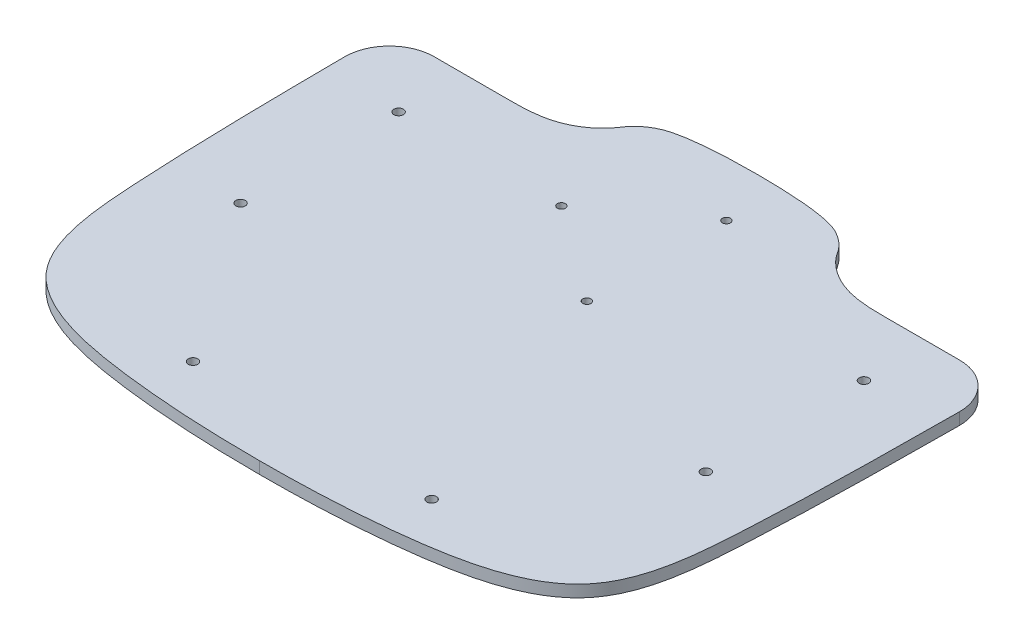
ISO-10303-21;
HEADER;
FILE_DESCRIPTION(('STEP AP214'),'2;1');
FILE_NAME('part.step','',(''),(''),'','','');
FILE_SCHEMA(('AUTOMOTIVE_DESIGN { 1 0 10303 214 1 1 1 1 }'));
ENDSEC;
DATA;
#1=APPLICATION_CONTEXT('core data for automotive mechanical design processes');
#2=APPLICATION_PROTOCOL_DEFINITION('international standard','automotive_design',2000,#1);
#3=PRODUCT_CONTEXT('',#1,'mechanical');
#4=PRODUCT('Part','Part','',(#3));
#5=PRODUCT_RELATED_PRODUCT_CATEGORY('part','',(#4));
#6=PRODUCT_DEFINITION_FORMATION('','',#4);
#7=PRODUCT_DEFINITION_CONTEXT('part definition',#1,'design');
#8=PRODUCT_DEFINITION('design','',#6,#7);
#9=PRODUCT_DEFINITION_SHAPE('','',#8);
#10=(LENGTH_UNIT() NAMED_UNIT(*) SI_UNIT(.MILLI.,.METRE.));
#11=(NAMED_UNIT(*) PLANE_ANGLE_UNIT() SI_UNIT($,.RADIAN.));
#12=(NAMED_UNIT(*) SI_UNIT($,.STERADIAN.) SOLID_ANGLE_UNIT());
#13=UNCERTAINTY_MEASURE_WITH_UNIT(LENGTH_MEASURE(1.E-05),#10,'distance_accuracy_value','');
#14=(GEOMETRIC_REPRESENTATION_CONTEXT(3) GLOBAL_UNCERTAINTY_ASSIGNED_CONTEXT((#13)) GLOBAL_UNIT_ASSIGNED_CONTEXT((#10,
#11,#12)) REPRESENTATION_CONTEXT('',''));
#15=CARTESIAN_POINT('',(0.,0.,0.));
#16=DIRECTION('',(0.,0.,1.));
#17=DIRECTION('',(1.,0.,0.));
#18=AXIS2_PLACEMENT_3D('',#15,#16,#17);
#19=CARTESIAN_POINT('',(0.,0.,0.));
#20=DIRECTION('',(0.,0.,1.));
#21=DIRECTION('',(1.,0.,0.));
#22=AXIS2_PLACEMENT_3D('',#19,#20,#21);
#23=PLANE('',#22);
#24=DIRECTION('',(1.,0.,0.));
#25=VECTOR('',#24,1.);
#26=CARTESIAN_POINT('',(0.,0.,0.));
#27=LINE('',#26,#25);
#28=CARTESIAN_POINT('',(-88.0691067868736,0.,0.));
#29=VERTEX_POINT('',#28);
#30=CARTESIAN_POINT('',(-62.5,0.,0.));
#31=VERTEX_POINT('',#30);
#32=EDGE_CURVE('E310',#29,#31,#27,.T.);
#33=ORIENTED_EDGE('',*,*,#32,.F.);
#34=DIRECTION('',(0.,1.,0.));
#35=VECTOR('',#34,1.);
#36=CARTESIAN_POINT('',(-88.0691067868736,0.,0.));
#37=LINE('',#36,#35);
#38=CARTESIAN_POINT('',(-88.0691067868736,4.,0.));
#39=VERTEX_POINT('',#38);
#40=EDGE_CURVE('E106',#29,#39,#37,.T.);
#41=ORIENTED_EDGE('',*,*,#40,.T.);
#42=DIRECTION('',(1.,0.,0.));
#43=VECTOR('',#42,1.);
#44=CARTESIAN_POINT('',(0.,4.,0.));
#45=LINE('',#44,#43);
#46=CARTESIAN_POINT('',(-62.5,4.,0.));
#47=VERTEX_POINT('',#46);
#48=EDGE_CURVE('E315',#39,#47,#45,.T.);
#49=ORIENTED_EDGE('',*,*,#48,.T.);
#50=DIRECTION('',(0.,1.,0.));
#51=VECTOR('',#50,1.);
#52=CARTESIAN_POINT('',(-62.5,0.,0.));
#53=LINE('',#52,#51);
#54=EDGE_CURVE('E256',#31,#47,#53,.T.);
#55=ORIENTED_EDGE('',*,*,#54,.F.);
#56=EDGE_LOOP('',(#33,#41,#49,#55));
#57=FACE_BOUND('',#56,.T.);
#58=ADVANCED_FACE('F96',(#57),#23,.F.);
#59=CARTESIAN_POINT('',(0.,4.,0.));
#60=DIRECTION('',(0.,-1.,0.));
#61=DIRECTION('',(0.,0.,-1.));
#62=AXIS2_PLACEMENT_3D('',#59,#60,#61);
#63=PLANE('',#62);
#64=CARTESIAN_POINT('',(8.49999999999999,4.,-1.4));
#65=DIRECTION('',(0.,1.,0.));
#66=DIRECTION('',(0.,0.,1.));
#67=AXIS2_PLACEMENT_3D('',#64,#65,#66);
#68=CIRCLE('',#67,1.35);
#69=CARTESIAN_POINT('',(8.49999999999999,4.,-0.049999999999998));
#70=VERTEX_POINT('',#69);
#71=EDGE_CURVE('E340',#70,#70,#68,.T.);
#72=ORIENTED_EDGE('',*,*,#71,.F.);
#73=EDGE_LOOP('',(#72));
#74=FACE_BOUND('',#73,.T.);
#75=CARTESIAN_POINT('',(8.49999999999999,4.,45.4));
#76=DIRECTION('',(0.,1.,0.));
#77=DIRECTION('',(0.,0.,1.));
#78=AXIS2_PLACEMENT_3D('',#75,#76,#77);
#79=CIRCLE('',#78,1.35);
#80=CARTESIAN_POINT('',(8.49999999999999,4.,46.75));
#81=VERTEX_POINT('',#80);
#82=EDGE_CURVE('E420',#81,#81,#79,.T.);
#83=ORIENTED_EDGE('',*,*,#82,.F.);
#84=EDGE_LOOP('',(#83));
#85=FACE_BOUND('',#84,.T.);
#86=CARTESIAN_POINT('',(-23.42,4.,22.));
#87=DIRECTION('',(0.,1.,0.));
#88=DIRECTION('',(0.,0.,1.));
#89=AXIS2_PLACEMENT_3D('',#86,#87,#88);
#90=CIRCLE('',#89,1.35000000000001);
#91=CARTESIAN_POINT('',(-23.42,4.,23.35));
#92=VERTEX_POINT('',#91);
#93=EDGE_CURVE('E417',#92,#92,#90,.T.);
#94=ORIENTED_EDGE('',*,*,#93,.F.);
#95=EDGE_LOOP('',(#94));
#96=FACE_BOUND('',#95,.T.);
#97=CARTESIAN_POINT('',(40.,4.,128.95));
#98=DIRECTION('',(0.,1.,0.));
#99=DIRECTION('',(0.,0.,1.));
#100=AXIS2_PLACEMENT_3D('',#97,#98,#99);
#101=CIRCLE('',#100,1.6);
#102=CARTESIAN_POINT('',(40.,4.,130.55));
#103=VERTEX_POINT('',#102);
#104=EDGE_CURVE('E270',#103,#103,#101,.T.);
#105=ORIENTED_EDGE('',*,*,#104,.F.);
#106=EDGE_LOOP('',(#105));
#107=FACE_BOUND('',#106,.T.);
#108=CARTESIAN_POINT('',(78.,4.,22.));
#109=DIRECTION('',(0.,1.,0.));
#110=DIRECTION('',(0.,0.,1.));
#111=AXIS2_PLACEMENT_3D('',#108,#109,#110);
#112=CIRCLE('',#111,1.6);
#113=CARTESIAN_POINT('',(78.,4.,23.6));
#114=VERTEX_POINT('',#113);
#115=EDGE_CURVE('E279',#114,#114,#112,.T.);
#116=ORIENTED_EDGE('',*,*,#115,.F.);
#117=EDGE_LOOP('',(#116));
#118=FACE_BOUND('',#117,.T.);
#119=CARTESIAN_POINT('',(-40.,4.,128.95));
#120=DIRECTION('',(0.,1.,0.));
#121=DIRECTION('',(0.,0.,-1.));
#122=AXIS2_PLACEMENT_3D('',#119,#120,#121);
#123=CIRCLE('',#122,1.6);
#124=CARTESIAN_POINT('',(-40.,4.,127.35));
#125=VERTEX_POINT('',#124);
#126=EDGE_CURVE('E287',#125,#125,#123,.T.);
#127=ORIENTED_EDGE('',*,*,#126,.F.);
#128=EDGE_LOOP('',(#127));
#129=FACE_BOUND('',#128,.T.);
#130=CARTESIAN_POINT('',(-78.,4.,75.));
#131=DIRECTION('',(0.,1.,0.));
#132=DIRECTION('',(0.,0.,-1.));
#133=AXIS2_PLACEMENT_3D('',#130,#131,#132);
#134=CIRCLE('',#133,1.60000000000001);
#135=CARTESIAN_POINT('',(-78.,4.,73.4));
#136=VERTEX_POINT('',#135);
#137=EDGE_CURVE('E295',#136,#136,#134,.T.);
#138=ORIENTED_EDGE('',*,*,#137,.F.);
#139=EDGE_LOOP('',(#138));
#140=FACE_BOUND('',#139,.T.);
#141=CARTESIAN_POINT('',(-78.,4.,22.));
#142=DIRECTION('',(0.,1.,0.));
#143=DIRECTION('',(0.,0.,-1.));
#144=AXIS2_PLACEMENT_3D('',#141,#142,#143);
#145=CIRCLE('',#144,1.6);
#146=CARTESIAN_POINT('',(-78.,4.,20.4));
#147=VERTEX_POINT('',#146);
#148=EDGE_CURVE('E262',#147,#147,#145,.T.);
#149=ORIENTED_EDGE('',*,*,#148,.F.);
#150=EDGE_LOOP('',(#149));
#151=FACE_BOUND('',#150,.T.);
#152=CARTESIAN_POINT('',(78.,4.,75.));
#153=DIRECTION('',(0.,1.,0.));
#154=DIRECTION('',(0.,0.,1.));
#155=AXIS2_PLACEMENT_3D('',#152,#153,#154);
#156=CIRCLE('',#155,1.60000000000001);
#157=CARTESIAN_POINT('',(78.,4.,76.6));
#158=VERTEX_POINT('',#157);
#159=EDGE_CURVE('E274',#158,#158,#156,.T.);
#160=ORIENTED_EDGE('',*,*,#159,.F.);
#161=EDGE_LOOP('',(#160));
#162=FACE_BOUND('',#161,.T.);
#163=CARTESIAN_POINT('',(103.110137057559,4.,0.));
#164=CARTESIAN_POINT('',(103.110137057559,4.,11.5682586964533));
#165=CARTESIAN_POINT('',(102.923272874501,4.,39.7469169239302));
#166=CARTESIAN_POINT('',(102.12424657233,4.,80.8713543352948));
#167=CARTESIAN_POINT('',(97.960421981102,4.,134.56749983205));
#168=CARTESIAN_POINT('',(46.7542459708844,4.,145.639494104606));
#169=CARTESIAN_POINT('',(13.4599171651995,4.,146.590313568996));
#170=CARTESIAN_POINT('',(0.,4.,146.590313568996));
#171=B_SPLINE_CURVE_WITH_KNOTS('',3,(#163,#164,#165,#166,#167,#168,#169,#170),.UNSPECIFIED.,.F.,
.F.,(4,1,1,1,1,4),(0.,0.150588902392539,0.384655916333677,0.576295649896841,0.785465422621598,
1.),.UNSPECIFIED.);
#172=CARTESIAN_POINT('',(103.068884638177,4.,15.0816358471947));
#173=VERTEX_POINT('',#172);
#174=CARTESIAN_POINT('',(0.,4.,146.590313568996));
#175=VERTEX_POINT('',#174);
#176=EDGE_CURVE('E180',#173,#175,#171,.T.);
#177=ORIENTED_EDGE('',*,*,#176,.F.);
#178=CARTESIAN_POINT('',(88.0691067868736,4.,14.9999999999999));
#179=DIRECTION('',(0.,-1.,0.));
#180=DIRECTION('',(0.,0.,-1.));
#181=AXIS2_PLACEMENT_3D('',#178,#179,#180);
#182=CIRCLE('',#181,15.);
#183=CARTESIAN_POINT('',(88.0691067868736,4.,0.));
#184=VERTEX_POINT('',#183);
#185=EDGE_CURVE('E323',#173,#184,#182,.F.);
#186=ORIENTED_EDGE('',*,*,#185,.T.);
#187=CARTESIAN_POINT('',(62.5,4.,0.));
#188=VERTEX_POINT('',#187);
#189=EDGE_CURVE('E306',#188,#184,#45,.T.);
#190=ORIENTED_EDGE('',*,*,#189,.F.);
#191=CARTESIAN_POINT('',(62.5,4.,0.));
#192=CARTESIAN_POINT('',(56.8592599155395,4.,0.));
#193=CARTESIAN_POINT('',(47.566912037307,4.,-0.719259661720086));
#194=CARTESIAN_POINT('',(37.2478070440371,4.,-7.96501971429529));
#195=CARTESIAN_POINT('',(35.0117331658653,4.,-13.7062667081815));
#196=CARTESIAN_POINT('',(25.174107503981,4.,-19.0991290572752));
#197=CARTESIAN_POINT('',(11.4614649401019,4.,-20.));
#198=CARTESIAN_POINT('',(0.,4.,-20.));
#199=B_SPLINE_CURVE_WITH_KNOTS('',3,(#191,#192,#193,#194,#195,#196,#197,#198),.UNSPECIFIED.,.F.,
.F.,(4,1,1,1,1,4),(0.,0.283628685609969,0.580942943118853,0.775947595519025,0.81785330120714,
1.),.UNSPECIFIED.);
#200=CARTESIAN_POINT('',(0.,4.,-20.));
#201=VERTEX_POINT('',#200);
#202=EDGE_CURVE('E183',#188,#201,#199,.T.);
#203=ORIENTED_EDGE('',*,*,#202,.T.);
#204=CARTESIAN_POINT('',(0.,4.,-20.));
#205=CARTESIAN_POINT('',(-11.4614649401019,4.,-20.));
#206=CARTESIAN_POINT('',(-25.174107503981,4.,-19.0991290572752));
#207=CARTESIAN_POINT('',(-35.0117331658653,4.,-13.7062667081815));
#208=CARTESIAN_POINT('',(-37.2478070440371,4.,-7.96501971429529));
#209=CARTESIAN_POINT('',(-47.566912037307,4.,-0.719259661720086));
#210=CARTESIAN_POINT('',(-56.8592599155395,4.,0.));
#211=CARTESIAN_POINT('',(-62.5,4.,0.));
#212=B_SPLINE_CURVE_WITH_KNOTS('',3,(#204,#205,#206,#207,#208,#209,#210,#211),.UNSPECIFIED.,.F.,
.F.,(4,1,1,1,1,4),(0.,0.18214669879286,0.224052404480975,0.419057056881147,0.716371314390031,
1.),.UNSPECIFIED.);
#213=EDGE_CURVE('E239',#201,#47,#212,.T.);
#214=ORIENTED_EDGE('',*,*,#213,.T.);
#215=ORIENTED_EDGE('',*,*,#48,.F.);
#216=CARTESIAN_POINT('',(-88.0691067868736,4.,15.));
#217=DIRECTION('',(0.,-1.,0.));
#218=DIRECTION('',(0.,0.,-1.));
#219=AXIS2_PLACEMENT_3D('',#216,#217,#218);
#220=CIRCLE('',#219,15.);
#221=CARTESIAN_POINT('',(-103.068884638177,4.,15.0816358471947));
#222=VERTEX_POINT('',#221);
#223=EDGE_CURVE('E320',#39,#222,#220,.F.);
#224=ORIENTED_EDGE('',*,*,#223,.T.);
#225=CARTESIAN_POINT('',(0.,4.,146.590313568996));
#226=CARTESIAN_POINT('',(-13.4599171651995,4.,146.590313568996));
#227=CARTESIAN_POINT('',(-46.7542459708844,4.,145.639494104606));
#228=CARTESIAN_POINT('',(-97.960421981102,4.,134.56749983205));
#229=CARTESIAN_POINT('',(-102.12424657233,4.,80.8713543352949));
#230=CARTESIAN_POINT('',(-102.923272874501,4.,39.7469169239302));
#231=CARTESIAN_POINT('',(-103.110137057559,4.,11.5682586964534));
#232=CARTESIAN_POINT('',(-103.110137057559,4.,0.));
#233=B_SPLINE_CURVE_WITH_KNOTS('',3,(#225,#226,#227,#228,#229,#230,#231,#232),.UNSPECIFIED.,.F.,
.F.,(4,1,1,1,1,4),(0.,0.214534577378402,0.423704350103159,0.615344083666323,0.849411097607461,
1.),.UNSPECIFIED.);
#234=EDGE_CURVE('E174',#175,#222,#233,.T.);
#235=ORIENTED_EDGE('',*,*,#234,.F.);
#236=EDGE_LOOP('',(#177,#186,#190,#203,#214,#215,#224,#235));
#237=FACE_BOUND('',#236,.T.);
#238=ADVANCED_FACE('F362',(#74,#85,#96,#107,#118,#129,#140,#151,#162,#237),#63,.F.);
#239=CARTESIAN_POINT('',(0.,0.,0.));
#240=DIRECTION('',(0.,-1.,0.));
#241=DIRECTION('',(0.,0.,-1.));
#242=AXIS2_PLACEMENT_3D('',#239,#240,#241);
#243=PLANE('',#242);
#244=CARTESIAN_POINT('',(8.49999999999999,0.,-1.4));
#245=DIRECTION('',(0.,-1.,0.));
#246=DIRECTION('',(0.,0.,-1.));
#247=AXIS2_PLACEMENT_3D('',#244,#245,#246);
#248=CIRCLE('',#247,1.35);
#249=CARTESIAN_POINT('',(8.49999999999999,0.,-2.75));
#250=VERTEX_POINT('',#249);
#251=EDGE_CURVE('E100',#250,#250,#248,.T.);
#252=ORIENTED_EDGE('',*,*,#251,.F.);
#253=EDGE_LOOP('',(#252));
#254=FACE_BOUND('',#253,.T.);
#255=CARTESIAN_POINT('',(8.49999999999999,0.,45.4));
#256=DIRECTION('',(0.,-1.,0.));
#257=DIRECTION('',(0.,0.,-1.));
#258=AXIS2_PLACEMENT_3D('',#255,#256,#257);
#259=CIRCLE('',#258,1.35);
#260=CARTESIAN_POINT('',(8.49999999999999,0.,44.05));
#261=VERTEX_POINT('',#260);
#262=EDGE_CURVE('E339',#261,#261,#259,.T.);
#263=ORIENTED_EDGE('',*,*,#262,.F.);
#264=EDGE_LOOP('',(#263));
#265=FACE_BOUND('',#264,.T.);
#266=CARTESIAN_POINT('',(-23.42,0.,22.));
#267=DIRECTION('',(0.,-1.,0.));
#268=DIRECTION('',(0.,0.,-1.));
#269=AXIS2_PLACEMENT_3D('',#266,#267,#268);
#270=CIRCLE('',#269,1.35000000000001);
#271=CARTESIAN_POINT('',(-23.42,0.,20.65));
#272=VERTEX_POINT('',#271);
#273=EDGE_CURVE('E336',#272,#272,#270,.T.);
#274=ORIENTED_EDGE('',*,*,#273,.F.);
#275=EDGE_LOOP('',(#274));
#276=FACE_BOUND('',#275,.T.);
#277=CARTESIAN_POINT('',(62.5,0.,0.));
#278=VERTEX_POINT('',#277);
#279=CARTESIAN_POINT('',(88.0691067868736,0.,0.));
#280=VERTEX_POINT('',#279);
#281=EDGE_CURVE('E314',#278,#280,#27,.T.);
#282=ORIENTED_EDGE('',*,*,#281,.T.);
#283=CARTESIAN_POINT('',(88.0691067868736,0.,14.9999999999999));
#284=DIRECTION('',(0.,-1.,0.));
#285=DIRECTION('',(0.,0.,-1.));
#286=AXIS2_PLACEMENT_3D('',#283,#284,#285);
#287=CIRCLE('',#286,15.);
#288=CARTESIAN_POINT('',(103.068884638177,0.,15.0816358471947));
#289=VERTEX_POINT('',#288);
#290=EDGE_CURVE('E169',#280,#289,#287,.T.);
#291=ORIENTED_EDGE('',*,*,#290,.T.);
#292=CARTESIAN_POINT('',(103.110137057559,0.,0.));
#293=CARTESIAN_POINT('',(103.110137057559,0.,11.5682586964533));
#294=CARTESIAN_POINT('',(102.923272874501,0.,39.7469169239302));
#295=CARTESIAN_POINT('',(102.12424657233,0.,80.8713543352948));
#296=CARTESIAN_POINT('',(97.960421981102,0.,134.56749983205));
#297=CARTESIAN_POINT('',(46.7542459708844,0.,145.639494104606));
#298=CARTESIAN_POINT('',(13.4599171651995,0.,146.590313568996));
#299=CARTESIAN_POINT('',(0.,0.,146.590313568996));
#300=B_SPLINE_CURVE_WITH_KNOTS('',3,(#292,#293,#294,#295,#296,#297,#298,#299),.UNSPECIFIED.,.F.,
.F.,(4,1,1,1,1,4),(0.,0.150588902392539,0.384655916333677,0.576295649896841,0.785465422621598,
1.),.UNSPECIFIED.);
#301=CARTESIAN_POINT('',(0.,0.,146.590313568996));
#302=VERTEX_POINT('',#301);
#303=EDGE_CURVE('E162',#289,#302,#300,.T.);
#304=ORIENTED_EDGE('',*,*,#303,.T.);
#305=CARTESIAN_POINT('',(0.,0.,146.590313568996));
#306=CARTESIAN_POINT('',(-13.4599171651995,0.,146.590313568996));
#307=CARTESIAN_POINT('',(-46.7542459708844,0.,145.639494104606));
#308=CARTESIAN_POINT('',(-97.960421981102,0.,134.56749983205));
#309=CARTESIAN_POINT('',(-102.12424657233,0.,80.8713543352949));
#310=CARTESIAN_POINT('',(-102.923272874501,0.,39.7469169239302));
#311=CARTESIAN_POINT('',(-103.110137057559,0.,11.5682586964534));
#312=CARTESIAN_POINT('',(-103.110137057559,0.,0.));
#313=B_SPLINE_CURVE_WITH_KNOTS('',3,(#305,#306,#307,#308,#309,#310,#311,#312),.UNSPECIFIED.,.F.,
.F.,(4,1,1,1,1,4),(0.,0.214534577378402,0.423704350103159,0.615344083666323,0.849411097607461,
1.),.UNSPECIFIED.);
#314=CARTESIAN_POINT('',(-103.068884638177,0.,15.0816358471947));
#315=VERTEX_POINT('',#314);
#316=EDGE_CURVE('E167',#302,#315,#313,.T.);
#317=ORIENTED_EDGE('',*,*,#316,.T.);
#318=CARTESIAN_POINT('',(-88.0691067868736,0.,15.));
#319=DIRECTION('',(0.,-1.,0.));
#320=DIRECTION('',(0.,0.,-1.));
#321=AXIS2_PLACEMENT_3D('',#318,#319,#320);
#322=CIRCLE('',#321,15.);
#323=EDGE_CURVE('E114',#315,#29,#322,.T.);
#324=ORIENTED_EDGE('',*,*,#323,.T.);
#325=ORIENTED_EDGE('',*,*,#32,.T.);
#326=CARTESIAN_POINT('',(0.,0.,-20.));
#327=CARTESIAN_POINT('',(-11.4614649401019,0.,-20.));
#328=CARTESIAN_POINT('',(-25.174107503981,0.,-19.0991290572752));
#329=CARTESIAN_POINT('',(-35.0117331658653,0.,-13.7062667081815));
#330=CARTESIAN_POINT('',(-37.2478070440371,0.,-7.96501971429529));
#331=CARTESIAN_POINT('',(-47.566912037307,0.,-0.719259661720086));
#332=CARTESIAN_POINT('',(-56.8592599155395,0.,0.));
#333=CARTESIAN_POINT('',(-62.5,0.,0.));
#334=B_SPLINE_CURVE_WITH_KNOTS('',3,(#326,#327,#328,#329,#330,#331,#332,#333),.UNSPECIFIED.,.F.,
.F.,(4,1,1,1,1,4),(0.,0.18214669879286,0.224052404480975,0.419057056881147,0.716371314390031,
1.),.UNSPECIFIED.);
#335=CARTESIAN_POINT('',(0.,0.,-20.));
#336=VERTEX_POINT('',#335);
#337=EDGE_CURVE('E219',#336,#31,#334,.T.);
#338=ORIENTED_EDGE('',*,*,#337,.F.);
#339=CARTESIAN_POINT('',(62.5,0.,0.));
#340=CARTESIAN_POINT('',(56.8592599155395,0.,0.));
#341=CARTESIAN_POINT('',(47.566912037307,0.,-0.719259661720086));
#342=CARTESIAN_POINT('',(37.2478070440371,0.,-7.96501971429529));
#343=CARTESIAN_POINT('',(35.0117331658653,0.,-13.7062667081815));
#344=CARTESIAN_POINT('',(25.174107503981,0.,-19.0991290572752));
#345=CARTESIAN_POINT('',(11.4614649401019,0.,-20.));
#346=CARTESIAN_POINT('',(0.,0.,-20.));
#347=B_SPLINE_CURVE_WITH_KNOTS('',3,(#339,#340,#341,#342,#343,#344,#345,#346),.UNSPECIFIED.,.F.,
.F.,(4,1,1,1,1,4),(0.,0.283628685609969,0.580942943118853,0.775947595519025,0.81785330120714,
1.),.UNSPECIFIED.);
#348=EDGE_CURVE('E227',#278,#336,#347,.T.);
#349=ORIENTED_EDGE('',*,*,#348,.F.);
#350=EDGE_LOOP('',(#282,#291,#304,#317,#324,#325,#338,#349));
#351=FACE_BOUND('',#350,.T.);
#352=CARTESIAN_POINT('',(40.,0.,128.95));
#353=DIRECTION('',(0.,1.,0.));
#354=DIRECTION('',(0.,0.,1.));
#355=AXIS2_PLACEMENT_3D('',#352,#353,#354);
#356=CIRCLE('',#355,1.6);
#357=CARTESIAN_POINT('',(40.,0.,130.55));
#358=VERTEX_POINT('',#357);
#359=EDGE_CURVE('E275',#358,#358,#356,.T.);
#360=ORIENTED_EDGE('',*,*,#359,.T.);
#361=EDGE_LOOP('',(#360));
#362=FACE_BOUND('',#361,.T.);
#363=CARTESIAN_POINT('',(78.,0.,22.));
#364=DIRECTION('',(0.,1.,0.));
#365=DIRECTION('',(0.,0.,1.));
#366=AXIS2_PLACEMENT_3D('',#363,#364,#365);
#367=CIRCLE('',#366,1.6);
#368=CARTESIAN_POINT('',(78.,0.,23.6));
#369=VERTEX_POINT('',#368);
#370=EDGE_CURVE('E283',#369,#369,#367,.T.);
#371=ORIENTED_EDGE('',*,*,#370,.T.);
#372=EDGE_LOOP('',(#371));
#373=FACE_BOUND('',#372,.T.);
#374=CARTESIAN_POINT('',(-40.,0.,128.95));
#375=DIRECTION('',(0.,1.,0.));
#376=DIRECTION('',(0.,0.,-1.));
#377=AXIS2_PLACEMENT_3D('',#374,#375,#376);
#378=CIRCLE('',#377,1.6);
#379=CARTESIAN_POINT('',(-40.,0.,127.35));
#380=VERTEX_POINT('',#379);
#381=EDGE_CURVE('E291',#380,#380,#378,.T.);
#382=ORIENTED_EDGE('',*,*,#381,.T.);
#383=EDGE_LOOP('',(#382));
#384=FACE_BOUND('',#383,.T.);
#385=CARTESIAN_POINT('',(-78.,0.,75.));
#386=DIRECTION('',(0.,1.,0.));
#387=DIRECTION('',(0.,0.,-1.));
#388=AXIS2_PLACEMENT_3D('',#385,#386,#387);
#389=CIRCLE('',#388,1.60000000000001);
#390=CARTESIAN_POINT('',(-78.,0.,73.4));
#391=VERTEX_POINT('',#390);
#392=EDGE_CURVE('E266',#391,#391,#389,.T.);
#393=ORIENTED_EDGE('',*,*,#392,.T.);
#394=EDGE_LOOP('',(#393));
#395=FACE_BOUND('',#394,.T.);
#396=CARTESIAN_POINT('',(-78.,0.,22.));
#397=DIRECTION('',(0.,1.,0.));
#398=DIRECTION('',(0.,0.,-1.));
#399=AXIS2_PLACEMENT_3D('',#396,#397,#398);
#400=CIRCLE('',#399,1.6);
#401=CARTESIAN_POINT('',(-78.,0.,20.4));
#402=VERTEX_POINT('',#401);
#403=EDGE_CURVE('E255',#402,#402,#400,.T.);
#404=ORIENTED_EDGE('',*,*,#403,.T.);
#405=EDGE_LOOP('',(#404));
#406=FACE_BOUND('',#405,.T.);
#407=CARTESIAN_POINT('',(78.,0.,75.));
#408=DIRECTION('',(0.,1.,0.));
#409=DIRECTION('',(0.,0.,1.));
#410=AXIS2_PLACEMENT_3D('',#407,#408,#409);
#411=CIRCLE('',#410,1.60000000000001);
#412=CARTESIAN_POINT('',(78.,0.,76.6));
#413=VERTEX_POINT('',#412);
#414=EDGE_CURVE('E302',#413,#413,#411,.T.);
#415=ORIENTED_EDGE('',*,*,#414,.T.);
#416=EDGE_LOOP('',(#415));
#417=FACE_BOUND('',#416,.T.);
#418=ADVANCED_FACE('F165',(#254,#265,#276,#351,#362,#373,#384,#395,#406,#417),#243,.T.);
#419=ORIENTED_EDGE('',*,*,#189,.T.);
#420=DIRECTION('',(0.,1.,0.));
#421=VECTOR('',#420,1.);
#422=CARTESIAN_POINT('',(88.0691067868736,0.,0.));
#423=LINE('',#422,#421);
#424=EDGE_CURVE('E326',#184,#280,#423,.F.);
#425=ORIENTED_EDGE('',*,*,#424,.T.);
#426=ORIENTED_EDGE('',*,*,#281,.F.);
#427=DIRECTION('',(0.,1.,0.));
#428=VECTOR('',#427,1.);
#429=CARTESIAN_POINT('',(62.5,0.,0.));
#430=LINE('',#429,#428);
#431=EDGE_CURVE('E248',#278,#188,#430,.T.);
#432=ORIENTED_EDGE('',*,*,#431,.T.);
#433=EDGE_LOOP('',(#419,#425,#426,#432));
#434=FACE_BOUND('',#433,.T.);
#435=ADVANCED_FACE('F377',(#434),#23,.F.);
#436=CARTESIAN_POINT('',(78.,0.,75.));
#437=DIRECTION('',(0.,1.,0.));
#438=DIRECTION('',(0.,0.,1.));
#439=AXIS2_PLACEMENT_3D('',#436,#437,#438);
#440=CYLINDRICAL_SURFACE('',#439,1.60000000000001);
#441=ORIENTED_EDGE('',*,*,#414,.F.);
#442=EDGE_LOOP('',(#441));
#443=FACE_BOUND('',#442,.T.);
#444=ORIENTED_EDGE('',*,*,#159,.T.);
#445=EDGE_LOOP('',(#444));
#446=FACE_BOUND('',#445,.T.);
#447=ADVANCED_FACE('F379',(#443,#446),#440,.F.);
#448=CARTESIAN_POINT('',(-78.,0.,22.));
#449=DIRECTION('',(0.,1.,0.));
#450=DIRECTION('',(0.,0.,1.));
#451=AXIS2_PLACEMENT_3D('',#448,#449,#450);
#452=CYLINDRICAL_SURFACE('',#451,1.6);
#453=ORIENTED_EDGE('',*,*,#403,.F.);
#454=EDGE_LOOP('',(#453));
#455=FACE_BOUND('',#454,.T.);
#456=ORIENTED_EDGE('',*,*,#148,.T.);
#457=EDGE_LOOP('',(#456));
#458=FACE_BOUND('',#457,.T.);
#459=ADVANCED_FACE('F385',(#455,#458),#452,.F.);
#460=CARTESIAN_POINT('',(-78.,0.,75.));
#461=DIRECTION('',(0.,1.,0.));
#462=DIRECTION('',(0.,0.,1.));
#463=AXIS2_PLACEMENT_3D('',#460,#461,#462);
#464=CYLINDRICAL_SURFACE('',#463,1.60000000000001);
#465=ORIENTED_EDGE('',*,*,#392,.F.);
#466=EDGE_LOOP('',(#465));
#467=FACE_BOUND('',#466,.T.);
#468=ORIENTED_EDGE('',*,*,#137,.T.);
#469=EDGE_LOOP('',(#468));
#470=FACE_BOUND('',#469,.T.);
#471=ADVANCED_FACE('F522',(#467,#470),#464,.F.);
#472=CARTESIAN_POINT('',(-40.,0.,128.95));
#473=DIRECTION('',(0.,1.,0.));
#474=DIRECTION('',(0.,0.,1.));
#475=AXIS2_PLACEMENT_3D('',#472,#473,#474);
#476=CYLINDRICAL_SURFACE('',#475,1.6);
#477=ORIENTED_EDGE('',*,*,#381,.F.);
#478=EDGE_LOOP('',(#477));
#479=FACE_BOUND('',#478,.T.);
#480=ORIENTED_EDGE('',*,*,#126,.T.);
#481=EDGE_LOOP('',(#480));
#482=FACE_BOUND('',#481,.T.);
#483=ADVANCED_FACE('F513',(#479,#482),#476,.F.);
#484=CARTESIAN_POINT('',(78.,0.,22.));
#485=DIRECTION('',(0.,1.,0.));
#486=DIRECTION('',(0.,0.,1.));
#487=AXIS2_PLACEMENT_3D('',#484,#485,#486);
#488=CYLINDRICAL_SURFACE('',#487,1.6);
#489=ORIENTED_EDGE('',*,*,#370,.F.);
#490=EDGE_LOOP('',(#489));
#491=FACE_BOUND('',#490,.T.);
#492=ORIENTED_EDGE('',*,*,#115,.T.);
#493=EDGE_LOOP('',(#492));
#494=FACE_BOUND('',#493,.T.);
#495=ADVANCED_FACE('F504',(#491,#494),#488,.F.);
#496=CARTESIAN_POINT('',(40.,0.,128.95));
#497=DIRECTION('',(0.,1.,0.));
#498=DIRECTION('',(0.,0.,1.));
#499=AXIS2_PLACEMENT_3D('',#496,#497,#498);
#500=CYLINDRICAL_SURFACE('',#499,1.6);
#501=ORIENTED_EDGE('',*,*,#359,.F.);
#502=EDGE_LOOP('',(#501));
#503=FACE_BOUND('',#502,.T.);
#504=ORIENTED_EDGE('',*,*,#104,.T.);
#505=EDGE_LOOP('',(#504));
#506=FACE_BOUND('',#505,.T.);
#507=ADVANCED_FACE('F477',(#503,#506),#500,.F.);
#508=DIRECTION('',(0.,1.,0.));
#509=VECTOR('',#508,1.);
#510=SURFACE_OF_LINEAR_EXTRUSION('',#347,#509);
#511=ORIENTED_EDGE('',*,*,#202,.F.);
#512=ORIENTED_EDGE('',*,*,#431,.F.);
#513=ORIENTED_EDGE('',*,*,#348,.T.);
#514=DIRECTION('',(0.,1.,0.));
#515=VECTOR('',#514,1.);
#516=CARTESIAN_POINT('',(0.,0.,-20.));
#517=LINE('',#516,#515);
#518=EDGE_CURVE('E226',#336,#201,#517,.T.);
#519=ORIENTED_EDGE('',*,*,#518,.T.);
#520=EDGE_LOOP('',(#511,#512,#513,#519));
#521=FACE_BOUND('',#520,.T.);
#522=ADVANCED_FACE('F215',(#521),#510,.T.);
#523=DIRECTION('',(0.,1.,0.));
#524=VECTOR('',#523,1.);
#525=SURFACE_OF_LINEAR_EXTRUSION('',#334,#524);
#526=ORIENTED_EDGE('',*,*,#213,.F.);
#527=ORIENTED_EDGE('',*,*,#518,.F.);
#528=ORIENTED_EDGE('',*,*,#337,.T.);
#529=ORIENTED_EDGE('',*,*,#54,.T.);
#530=EDGE_LOOP('',(#526,#527,#528,#529));
#531=FACE_BOUND('',#530,.T.);
#532=ADVANCED_FACE('F206',(#531),#525,.T.);
#533=DIRECTION('',(0.,1.,0.));
#534=VECTOR('',#533,1.);
#535=SURFACE_OF_LINEAR_EXTRUSION('',#313,#534);
#536=ORIENTED_EDGE('',*,*,#234,.T.);
#537=DIRECTION('',(0.,1.,0.));
#538=VECTOR('',#537,1.);
#539=CARTESIAN_POINT('',(-103.068884638177,4.,15.0816358471947));
#540=LINE('',#539,#538);
#541=EDGE_CURVE('E12',#222,#315,#540,.F.);
#542=ORIENTED_EDGE('',*,*,#541,.T.);
#543=ORIENTED_EDGE('',*,*,#316,.F.);
#544=DIRECTION('',(0.,1.,0.));
#545=VECTOR('',#544,1.);
#546=CARTESIAN_POINT('',(0.,0.,146.590313568996));
#547=LINE('',#546,#545);
#548=EDGE_CURVE('E177',#302,#175,#547,.T.);
#549=ORIENTED_EDGE('',*,*,#548,.T.);
#550=EDGE_LOOP('',(#536,#542,#543,#549));
#551=FACE_BOUND('',#550,.T.);
#552=ADVANCED_FACE('F185',(#551),#535,.F.);
#553=DIRECTION('',(0.,1.,0.));
#554=VECTOR('',#553,1.);
#555=SURFACE_OF_LINEAR_EXTRUSION('',#300,#554);
#556=ORIENTED_EDGE('',*,*,#303,.F.);
#557=DIRECTION('',(0.,1.,0.));
#558=VECTOR('',#557,1.);
#559=CARTESIAN_POINT('',(103.068884638177,0.,15.0816358471947));
#560=LINE('',#559,#558);
#561=EDGE_CURVE('E313',#289,#173,#560,.T.);
#562=ORIENTED_EDGE('',*,*,#561,.T.);
#563=ORIENTED_EDGE('',*,*,#176,.T.);
#564=ORIENTED_EDGE('',*,*,#548,.F.);
#565=EDGE_LOOP('',(#556,#562,#563,#564));
#566=FACE_BOUND('',#565,.T.);
#567=ADVANCED_FACE('F178',(#566),#555,.F.);
#568=CARTESIAN_POINT('',(88.0691067868736,2.,14.9999999999999));
#569=DIRECTION('',(0.,1.,0.));
#570=DIRECTION('',(0.,0.,1.));
#571=AXIS2_PLACEMENT_3D('',#568,#569,#570);
#572=CYLINDRICAL_SURFACE('',#571,15.);
#573=ORIENTED_EDGE('',*,*,#290,.F.);
#574=ORIENTED_EDGE('',*,*,#424,.F.);
#575=ORIENTED_EDGE('',*,*,#185,.F.);
#576=ORIENTED_EDGE('',*,*,#561,.F.);
#577=EDGE_LOOP('',(#573,#574,#575,#576));
#578=FACE_BOUND('',#577,.T.);
#579=ADVANCED_FACE('F211',(#578),#572,.T.);
#580=CARTESIAN_POINT('',(-88.0691067868736,2.,15.));
#581=DIRECTION('',(0.,1.,0.));
#582=DIRECTION('',(0.,0.,1.));
#583=AXIS2_PLACEMENT_3D('',#580,#581,#582);
#584=CYLINDRICAL_SURFACE('',#583,15.);
#585=ORIENTED_EDGE('',*,*,#323,.F.);
#586=ORIENTED_EDGE('',*,*,#541,.F.);
#587=ORIENTED_EDGE('',*,*,#223,.F.);
#588=ORIENTED_EDGE('',*,*,#40,.F.);
#589=EDGE_LOOP('',(#585,#586,#587,#588));
#590=FACE_BOUND('',#589,.T.);
#591=ADVANCED_FACE('F98',(#590),#584,.T.);
#592=CARTESIAN_POINT('',(-23.42,-6.,22.));
#593=DIRECTION('',(0.,1.,0.));
#594=DIRECTION('',(0.,0.,1.));
#595=AXIS2_PLACEMENT_3D('',#592,#593,#594);
#596=CYLINDRICAL_SURFACE('',#595,1.35000000000001);
#597=ORIENTED_EDGE('',*,*,#273,.T.);
#598=EDGE_LOOP('',(#597));
#599=FACE_BOUND('',#598,.T.);
#600=ORIENTED_EDGE('',*,*,#93,.T.);
#601=EDGE_LOOP('',(#600));
#602=FACE_BOUND('',#601,.T.);
#603=ADVANCED_FACE('F207',(#599,#602),#596,.F.);
#604=CARTESIAN_POINT('',(8.49999999999999,-6.,45.4));
#605=DIRECTION('',(0.,1.,0.));
#606=DIRECTION('',(0.,0.,1.));
#607=AXIS2_PLACEMENT_3D('',#604,#605,#606);
#608=CYLINDRICAL_SURFACE('',#607,1.35);
#609=ORIENTED_EDGE('',*,*,#262,.T.);
#610=EDGE_LOOP('',(#609));
#611=FACE_BOUND('',#610,.T.);
#612=ORIENTED_EDGE('',*,*,#82,.T.);
#613=EDGE_LOOP('',(#612));
#614=FACE_BOUND('',#613,.T.);
#615=ADVANCED_FACE('F407',(#611,#614),#608,.F.);
#616=CARTESIAN_POINT('',(8.49999999999999,-6.,-1.4));
#617=DIRECTION('',(0.,1.,0.));
#618=DIRECTION('',(0.,0.,1.));
#619=AXIS2_PLACEMENT_3D('',#616,#617,#618);
#620=CYLINDRICAL_SURFACE('',#619,1.35);
#621=ORIENTED_EDGE('',*,*,#251,.T.);
#622=EDGE_LOOP('',(#621));
#623=FACE_BOUND('',#622,.T.);
#624=ORIENTED_EDGE('',*,*,#71,.T.);
#625=EDGE_LOOP('',(#624));
#626=FACE_BOUND('',#625,.T.);
#627=ADVANCED_FACE('F412',(#623,#626),#620,.F.);
#628=CLOSED_SHELL('',(#58,#238,#418,#435,#447,#459,#471,#483,#495,#507,#522,#532,#552,#567,#579,
#591,#603,#615,#627));
#629=MANIFOLD_SOLID_BREP('B2',#628);
#630=ADVANCED_BREP_SHAPE_REPRESENTATION('',(#18,#629),#14);
#631=SHAPE_DEFINITION_REPRESENTATION(#9,#630);
ENDSEC;
END-ISO-10303-21;
